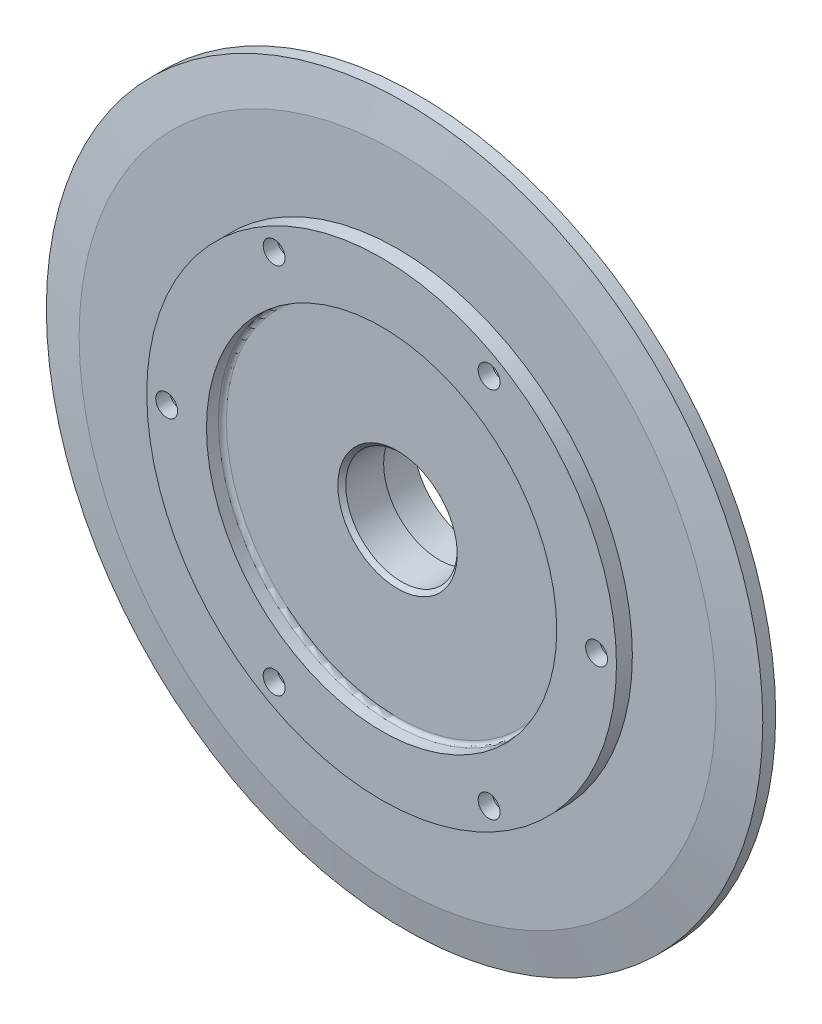
ISO-10303-21;
HEADER;
FILE_DESCRIPTION(('STEP AP214'),'2;1');
FILE_NAME('part.step','',(''),(''),'','','');
FILE_SCHEMA(('AUTOMOTIVE_DESIGN { 1 0 10303 214 1 1 1 1 }'));
ENDSEC;
DATA;
#1=APPLICATION_CONTEXT('core data for automotive mechanical design processes');
#2=APPLICATION_PROTOCOL_DEFINITION('international standard','automotive_design',2000,#1);
#3=PRODUCT_CONTEXT('',#1,'mechanical');
#4=PRODUCT('Part','Part','',(#3));
#5=PRODUCT_RELATED_PRODUCT_CATEGORY('part','',(#4));
#6=PRODUCT_DEFINITION_FORMATION('','',#4);
#7=PRODUCT_DEFINITION_CONTEXT('part definition',#1,'design');
#8=PRODUCT_DEFINITION('design','',#6,#7);
#9=PRODUCT_DEFINITION_SHAPE('','',#8);
#10=(LENGTH_UNIT() NAMED_UNIT(*) SI_UNIT(.MILLI.,.METRE.));
#11=(NAMED_UNIT(*) PLANE_ANGLE_UNIT() SI_UNIT($,.RADIAN.));
#12=(NAMED_UNIT(*) SI_UNIT($,.STERADIAN.) SOLID_ANGLE_UNIT());
#13=UNCERTAINTY_MEASURE_WITH_UNIT(LENGTH_MEASURE(1.E-05),#10,'distance_accuracy_value','');
#14=(GEOMETRIC_REPRESENTATION_CONTEXT(3) GLOBAL_UNCERTAINTY_ASSIGNED_CONTEXT((#13)) GLOBAL_UNIT_ASSIGNED_CONTEXT((#10,
#11,#12)) REPRESENTATION_CONTEXT('',''));
#15=CARTESIAN_POINT('',(0.,0.,0.));
#16=DIRECTION('',(0.,0.,1.));
#17=DIRECTION('',(1.,0.,0.));
#18=AXIS2_PLACEMENT_3D('',#15,#16,#17);
#19=CARTESIAN_POINT('',(0.,180.,-18.));
#20=DIRECTION('',(0.,0.,-1.));
#21=DIRECTION('',(-1.,0.,0.));
#22=AXIS2_PLACEMENT_3D('',#19,#20,#21);
#23=PLANE('',#22);
#24=CARTESIAN_POINT('',(0.,0.,-18.));
#25=DIRECTION('',(0.,0.,-1.));
#26=DIRECTION('',(-1.,0.,0.));
#27=AXIS2_PLACEMENT_3D('',#24,#25,#26);
#28=CIRCLE('',#27,45.);
#29=CARTESIAN_POINT('',(-45.,0.,-18.));
#30=VERTEX_POINT('',#29);
#31=EDGE_CURVE('E75',#30,#30,#28,.T.);
#32=ORIENTED_EDGE('',*,*,#31,.F.);
#33=EDGE_LOOP('',(#32));
#34=FACE_BOUND('',#33,.T.);
#35=CARTESIAN_POINT('',(0.,0.,-18.));
#36=DIRECTION('',(0.,0.,-1.));
#37=DIRECTION('',(-1.,0.,0.));
#38=AXIS2_PLACEMENT_3D('',#35,#36,#37);
#39=CIRCLE('',#38,70.);
#40=CARTESIAN_POINT('',(-70.,0.,-18.));
#41=VERTEX_POINT('',#40);
#42=EDGE_CURVE('E106',#41,#41,#39,.T.);
#43=ORIENTED_EDGE('',*,*,#42,.T.);
#44=EDGE_LOOP('',(#43));
#45=FACE_BOUND('',#44,.T.);
#46=ADVANCED_FACE('F39',(#34,#45),#23,.T.);
#47=CARTESIAN_POINT('',(0.,0.,0.));
#48=DIRECTION('',(0.,0.,1.));
#49=DIRECTION('',(1.,0.,0.));
#50=AXIS2_PLACEMENT_3D('',#47,#48,#49);
#51=PLANE('',#50);
#52=CARTESIAN_POINT('',(-108.,0.,0.));
#53=DIRECTION('',(0.,0.,1.));
#54=DIRECTION('',(1.,0.,0.));
#55=AXIS2_PLACEMENT_3D('',#52,#53,#54);
#56=CIRCLE('',#55,5.50000000000001);
#57=CARTESIAN_POINT('',(-102.5,0.,0.));
#58=VERTEX_POINT('',#57);
#59=EDGE_CURVE('E171',#58,#58,#56,.T.);
#60=ORIENTED_EDGE('',*,*,#59,.F.);
#61=EDGE_LOOP('',(#60));
#62=FACE_BOUND('',#61,.T.);
#63=CARTESIAN_POINT('',(-53.9999999999998,-93.5307436087195,0.));
#64=DIRECTION('',(0.,0.,1.));
#65=DIRECTION('',(1.,0.,0.));
#66=AXIS2_PLACEMENT_3D('',#63,#64,#65);
#67=CIRCLE('',#66,5.50000000000001);
#68=CARTESIAN_POINT('',(-48.4999999999998,-93.5307436087195,0.));
#69=VERTEX_POINT('',#68);
#70=EDGE_CURVE('E159',#69,#69,#67,.T.);
#71=ORIENTED_EDGE('',*,*,#70,.F.);
#72=EDGE_LOOP('',(#71));
#73=FACE_BOUND('',#72,.T.);
#74=CARTESIAN_POINT('',(54.0000000000004,-93.5307436087191,0.));
#75=DIRECTION('',(0.,0.,1.));
#76=DIRECTION('',(1.,0.,0.));
#77=AXIS2_PLACEMENT_3D('',#74,#75,#76);
#78=CIRCLE('',#77,5.50000000000001);
#79=CARTESIAN_POINT('',(59.5000000000004,-93.5307436087191,0.));
#80=VERTEX_POINT('',#79);
#81=EDGE_CURVE('E147',#80,#80,#78,.T.);
#82=ORIENTED_EDGE('',*,*,#81,.F.);
#83=EDGE_LOOP('',(#82));
#84=FACE_BOUND('',#83,.T.);
#85=CARTESIAN_POINT('',(108.,7.54159969190117E-13,0.));
#86=DIRECTION('',(0.,0.,1.));
#87=DIRECTION('',(1.,0.,0.));
#88=AXIS2_PLACEMENT_3D('',#85,#86,#87);
#89=CIRCLE('',#88,5.50000000000001);
#90=CARTESIAN_POINT('',(113.5,7.54159969190117E-13,0.));
#91=VERTEX_POINT('',#90);
#92=EDGE_CURVE('E135',#91,#91,#89,.T.);
#93=ORIENTED_EDGE('',*,*,#92,.F.);
#94=EDGE_LOOP('',(#93));
#95=FACE_BOUND('',#94,.T.);
#96=CARTESIAN_POINT('',(53.9999999999991,93.5307436087198,0.));
#97=DIRECTION('',(0.,0.,1.));
#98=DIRECTION('',(1.,0.,0.));
#99=AXIS2_PLACEMENT_3D('',#96,#97,#98);
#100=CIRCLE('',#99,5.50000000000001);
#101=CARTESIAN_POINT('',(59.4999999999991,93.5307436087198,0.));
#102=VERTEX_POINT('',#101);
#103=EDGE_CURVE('E123',#102,#102,#100,.T.);
#104=ORIENTED_EDGE('',*,*,#103,.F.);
#105=EDGE_LOOP('',(#104));
#106=FACE_BOUND('',#105,.T.);
#107=CARTESIAN_POINT('',(-54.0000000000011,93.5307436087187,0.));
#108=DIRECTION('',(0.,0.,1.));
#109=DIRECTION('',(1.,0.,0.));
#110=AXIS2_PLACEMENT_3D('',#107,#108,#109);
#111=CIRCLE('',#110,5.50000000000001);
#112=CARTESIAN_POINT('',(-48.5000000000011,93.5307436087187,0.));
#113=VERTEX_POINT('',#112);
#114=EDGE_CURVE('E109',#113,#113,#111,.T.);
#115=ORIENTED_EDGE('',*,*,#114,.F.);
#116=EDGE_LOOP('',(#115));
#117=FACE_BOUND('',#116,.T.);
#118=CARTESIAN_POINT('',(0.,0.,0.));
#119=DIRECTION('',(0.,0.,-1.));
#120=DIRECTION('',(-1.,0.,0.));
#121=AXIS2_PLACEMENT_3D('',#118,#119,#120);
#122=CIRCLE('',#121,88.);
#123=CARTESIAN_POINT('',(-88.,0.,0.));
#124=VERTEX_POINT('',#123);
#125=EDGE_CURVE('E87',#124,#124,#122,.T.);
#126=ORIENTED_EDGE('',*,*,#125,.T.);
#127=EDGE_LOOP('',(#126));
#128=FACE_BOUND('',#127,.T.);
#129=CARTESIAN_POINT('',(0.,0.,0.));
#130=DIRECTION('',(0.,0.,-1.));
#131=DIRECTION('',(-1.,0.,0.));
#132=AXIS2_PLACEMENT_3D('',#129,#130,#131);
#133=CIRCLE('',#132,118.);
#134=CARTESIAN_POINT('',(-118.,0.,0.));
#135=VERTEX_POINT('',#134);
#136=EDGE_CURVE('E60',#135,#135,#133,.T.);
#137=ORIENTED_EDGE('',*,*,#136,.F.);
#138=EDGE_LOOP('',(#137));
#139=FACE_BOUND('',#138,.T.);
#140=ADVANCED_FACE('F218',(#62,#73,#84,#95,#106,#117,#128,#139),#51,.T.);
#141=CARTESIAN_POINT('',(0.,0.,-47.));
#142=DIRECTION('',(0.,0.,-1.));
#143=DIRECTION('',(-1.,0.,0.));
#144=AXIS2_PLACEMENT_3D('',#141,#142,#143);
#145=CYLINDRICAL_SURFACE('',#144,118.);
#146=ORIENTED_EDGE('',*,*,#136,.T.);
#147=EDGE_LOOP('',(#146));
#148=FACE_BOUND('',#147,.T.);
#149=CARTESIAN_POINT('',(0.,0.,-8.00000000000001));
#150=DIRECTION('',(0.,0.,-1.));
#151=DIRECTION('',(-1.,0.,0.));
#152=AXIS2_PLACEMENT_3D('',#149,#150,#151);
#153=CIRCLE('',#152,118.);
#154=CARTESIAN_POINT('',(-118.,0.,-8.00000000000001));
#155=VERTEX_POINT('',#154);
#156=EDGE_CURVE('E63',#155,#155,#153,.T.);
#157=ORIENTED_EDGE('',*,*,#156,.F.);
#158=EDGE_LOOP('',(#157));
#159=FACE_BOUND('',#158,.T.);
#160=ADVANCED_FACE('F225',(#148,#159),#145,.T.);
#161=CARTESIAN_POINT('',(0.,118.,-8.00000000000001));
#162=DIRECTION('',(0.,0.,1.));
#163=DIRECTION('',(1.,0.,0.));
#164=AXIS2_PLACEMENT_3D('',#161,#162,#163);
#165=PLANE('',#164);
#166=ORIENTED_EDGE('',*,*,#156,.T.);
#167=EDGE_LOOP('',(#166));
#168=FACE_BOUND('',#167,.T.);
#169=CARTESIAN_POINT('',(0.,0.,-8.00000000000001));
#170=DIRECTION('',(0.,0.,-1.));
#171=DIRECTION('',(-1.,0.,0.));
#172=AXIS2_PLACEMENT_3D('',#169,#170,#171);
#173=CIRCLE('',#172,160.);
#174=CARTESIAN_POINT('',(-160.,0.,-8.00000000000001));
#175=VERTEX_POINT('',#174);
#176=EDGE_CURVE('E66',#175,#175,#173,.T.);
#177=ORIENTED_EDGE('',*,*,#176,.F.);
#178=EDGE_LOOP('',(#177));
#179=FACE_BOUND('',#178,.T.);
#180=ADVANCED_FACE('F214',(#168,#179),#165,.T.);
#181=CARTESIAN_POINT('',(0.,0.,-11.5265396141693));
#182=DIRECTION('',(0.,0.,-1.));
#183=DIRECTION('',(-1.,0.,0.));
#184=AXIS2_PLACEMENT_3D('',#181,#182,#183);
#185=CONICAL_SURFACE('',#184,180.,1.39626340159546);
#186=ORIENTED_EDGE('',*,*,#176,.T.);
#187=EDGE_LOOP('',(#186));
#188=FACE_BOUND('',#187,.T.);
#189=CARTESIAN_POINT('',(0.,0.,-11.5265396141693));
#190=DIRECTION('',(0.,0.,-1.));
#191=DIRECTION('',(-1.,0.,0.));
#192=AXIS2_PLACEMENT_3D('',#189,#190,#191);
#193=CIRCLE('',#192,180.);
#194=CARTESIAN_POINT('',(-180.,0.,-11.5265396141693));
#195=VERTEX_POINT('',#194);
#196=EDGE_CURVE('E69',#195,#195,#193,.T.);
#197=ORIENTED_EDGE('',*,*,#196,.F.);
#198=EDGE_LOOP('',(#197));
#199=FACE_BOUND('',#198,.T.);
#200=ADVANCED_FACE('F207',(#188,#199),#185,.T.);
#201=CARTESIAN_POINT('',(0.,0.,-47.));
#202=DIRECTION('',(0.,0.,-1.));
#203=DIRECTION('',(-1.,0.,0.));
#204=AXIS2_PLACEMENT_3D('',#201,#202,#203);
#205=CYLINDRICAL_SURFACE('',#204,180.);
#206=ORIENTED_EDGE('',*,*,#196,.T.);
#207=EDGE_LOOP('',(#206));
#208=FACE_BOUND('',#207,.T.);
#209=CARTESIAN_POINT('',(0.,0.,-18.));
#210=DIRECTION('',(0.,0.,-1.));
#211=DIRECTION('',(-1.,0.,0.));
#212=AXIS2_PLACEMENT_3D('',#209,#210,#211);
#213=CIRCLE('',#212,180.);
#214=CARTESIAN_POINT('',(-180.,0.,-18.));
#215=VERTEX_POINT('',#214);
#216=EDGE_CURVE('E72',#215,#215,#213,.T.);
#217=ORIENTED_EDGE('',*,*,#216,.F.);
#218=EDGE_LOOP('',(#217));
#219=FACE_BOUND('',#218,.T.);
#220=ADVANCED_FACE('F190',(#208,#219),#205,.T.);
#221=CARTESIAN_POINT('',(-108.,0.,-18.));
#222=DIRECTION('',(0.,0.,-1.));
#223=DIRECTION('',(-1.,0.,0.));
#224=AXIS2_PLACEMENT_3D('',#221,#222,#223);
#225=CIRCLE('',#224,8.50000000000001);
#226=CARTESIAN_POINT('',(-116.5,0.,-18.));
#227=VERTEX_POINT('',#226);
#228=EDGE_CURVE('E180',#227,#227,#225,.T.);
#229=ORIENTED_EDGE('',*,*,#228,.F.);
#230=EDGE_LOOP('',(#229));
#231=FACE_BOUND('',#230,.T.);
#232=CARTESIAN_POINT('',(-53.9999999999998,-93.5307436087195,-18.));
#233=DIRECTION('',(0.,0.,-1.));
#234=DIRECTION('',(-1.,0.,0.));
#235=AXIS2_PLACEMENT_3D('',#232,#233,#234);
#236=CIRCLE('',#235,8.50000000000001);
#237=CARTESIAN_POINT('',(-62.4999999999998,-93.5307436087195,-18.));
#238=VERTEX_POINT('',#237);
#239=EDGE_CURVE('E168',#238,#238,#236,.T.);
#240=ORIENTED_EDGE('',*,*,#239,.F.);
#241=EDGE_LOOP('',(#240));
#242=FACE_BOUND('',#241,.T.);
#243=CARTESIAN_POINT('',(54.0000000000004,-93.5307436087191,-18.));
#244=DIRECTION('',(0.,0.,-1.));
#245=DIRECTION('',(-1.,0.,0.));
#246=AXIS2_PLACEMENT_3D('',#243,#244,#245);
#247=CIRCLE('',#246,8.50000000000001);
#248=CARTESIAN_POINT('',(45.5000000000004,-93.5307436087191,-18.));
#249=VERTEX_POINT('',#248);
#250=EDGE_CURVE('E156',#249,#249,#247,.T.);
#251=ORIENTED_EDGE('',*,*,#250,.F.);
#252=EDGE_LOOP('',(#251));
#253=FACE_BOUND('',#252,.T.);
#254=CARTESIAN_POINT('',(108.,7.54159969190117E-13,-18.));
#255=DIRECTION('',(0.,0.,-1.));
#256=DIRECTION('',(-1.,0.,0.));
#257=AXIS2_PLACEMENT_3D('',#254,#255,#256);
#258=CIRCLE('',#257,8.50000000000001);
#259=CARTESIAN_POINT('',(99.5,7.54159969190117E-13,-18.));
#260=VERTEX_POINT('',#259);
#261=EDGE_CURVE('E144',#260,#260,#258,.T.);
#262=ORIENTED_EDGE('',*,*,#261,.F.);
#263=EDGE_LOOP('',(#262));
#264=FACE_BOUND('',#263,.T.);
#265=CARTESIAN_POINT('',(53.9999999999991,93.5307436087198,-18.));
#266=DIRECTION('',(0.,0.,-1.));
#267=DIRECTION('',(-1.,0.,0.));
#268=AXIS2_PLACEMENT_3D('',#265,#266,#267);
#269=CIRCLE('',#268,8.50000000000001);
#270=CARTESIAN_POINT('',(45.4999999999991,93.5307436087198,-18.));
#271=VERTEX_POINT('',#270);
#272=EDGE_CURVE('E132',#271,#271,#269,.T.);
#273=ORIENTED_EDGE('',*,*,#272,.F.);
#274=EDGE_LOOP('',(#273));
#275=FACE_BOUND('',#274,.T.);
#276=CARTESIAN_POINT('',(-54.0000000000011,93.5307436087187,-18.));
#277=DIRECTION('',(0.,0.,-1.));
#278=DIRECTION('',(-1.,0.,0.));
#279=AXIS2_PLACEMENT_3D('',#276,#277,#278);
#280=CIRCLE('',#279,8.50000000000001);
#281=CARTESIAN_POINT('',(-62.5000000000011,93.5307436087187,-18.));
#282=VERTEX_POINT('',#281);
#283=EDGE_CURVE('E120',#282,#282,#280,.T.);
#284=ORIENTED_EDGE('',*,*,#283,.F.);
#285=EDGE_LOOP('',(#284));
#286=FACE_BOUND('',#285,.T.);
#287=CARTESIAN_POINT('',(0.,0.,-18.));
#288=DIRECTION('',(0.,0.,-1.));
#289=DIRECTION('',(-1.,0.,0.));
#290=AXIS2_PLACEMENT_3D('',#287,#288,#289);
#291=CIRCLE('',#290,77.);
#292=CARTESIAN_POINT('',(-77.,0.,-18.));
#293=VERTEX_POINT('',#292);
#294=EDGE_CURVE('E100',#293,#293,#291,.T.);
#295=ORIENTED_EDGE('',*,*,#294,.F.);
#296=EDGE_LOOP('',(#295));
#297=FACE_BOUND('',#296,.T.);
#298=ORIENTED_EDGE('',*,*,#216,.T.);
#299=EDGE_LOOP('',(#298));
#300=FACE_BOUND('',#299,.T.);
#301=ADVANCED_FACE('F186',(#231,#242,#253,#264,#275,#286,#297,#300),#23,.T.);
#302=CARTESIAN_POINT('',(0.,0.,-47.));
#303=DIRECTION('',(0.,0.,-1.));
#304=DIRECTION('',(-1.,0.,0.));
#305=AXIS2_PLACEMENT_3D('',#302,#303,#304);
#306=CYLINDRICAL_SURFACE('',#305,45.);
#307=ORIENTED_EDGE('',*,*,#31,.T.);
#308=EDGE_LOOP('',(#307));
#309=FACE_BOUND('',#308,.T.);
#310=CARTESIAN_POINT('',(0.,0.,-21.));
#311=DIRECTION('',(0.,0.,-1.));
#312=DIRECTION('',(-1.,0.,0.));
#313=AXIS2_PLACEMENT_3D('',#310,#311,#312);
#314=CIRCLE('',#313,45.);
#315=CARTESIAN_POINT('',(-45.,0.,-21.));
#316=VERTEX_POINT('',#315);
#317=EDGE_CURVE('E78',#316,#316,#314,.T.);
#318=ORIENTED_EDGE('',*,*,#317,.F.);
#319=EDGE_LOOP('',(#318));
#320=FACE_BOUND('',#319,.T.);
#321=ADVANCED_FACE('F189',(#309,#320),#306,.T.);
#322=CARTESIAN_POINT('',(0.,45.,-21.));
#323=DIRECTION('',(0.,0.,-1.));
#324=DIRECTION('',(-1.,0.,0.));
#325=AXIS2_PLACEMENT_3D('',#322,#323,#324);
#326=PLANE('',#325);
#327=ORIENTED_EDGE('',*,*,#317,.T.);
#328=EDGE_LOOP('',(#327));
#329=FACE_BOUND('',#328,.T.);
#330=CARTESIAN_POINT('',(0.,0.,-21.));
#331=DIRECTION('',(0.,0.,-1.));
#332=DIRECTION('',(-1.,0.,0.));
#333=AXIS2_PLACEMENT_3D('',#330,#331,#332);
#334=CIRCLE('',#333,40.);
#335=CARTESIAN_POINT('',(-40.,0.,-21.));
#336=VERTEX_POINT('',#335);
#337=EDGE_CURVE('E81',#336,#336,#334,.T.);
#338=ORIENTED_EDGE('',*,*,#337,.F.);
#339=EDGE_LOOP('',(#338));
#340=FACE_BOUND('',#339,.T.);
#341=ADVANCED_FACE('F232',(#329,#340),#326,.T.);
#342=CARTESIAN_POINT('',(0.,0.,-47.));
#343=DIRECTION('',(0.,0.,-1.));
#344=DIRECTION('',(-1.,0.,0.));
#345=AXIS2_PLACEMENT_3D('',#342,#343,#344);
#346=CYLINDRICAL_SURFACE('',#345,40.);
#347=ORIENTED_EDGE('',*,*,#337,.T.);
#348=EDGE_LOOP('',(#347));
#349=FACE_BOUND('',#348,.T.);
#350=CARTESIAN_POINT('',(0.,0.,-47.));
#351=DIRECTION('',(0.,0.,-1.));
#352=DIRECTION('',(-1.,0.,0.));
#353=AXIS2_PLACEMENT_3D('',#350,#351,#352);
#354=CIRCLE('',#353,40.);
#355=CARTESIAN_POINT('',(-40.,0.,-47.));
#356=VERTEX_POINT('',#355);
#357=EDGE_CURVE('E84',#356,#356,#354,.T.);
#358=ORIENTED_EDGE('',*,*,#357,.F.);
#359=EDGE_LOOP('',(#358));
#360=FACE_BOUND('',#359,.T.);
#361=ADVANCED_FACE('F236',(#349,#360),#346,.T.);
#362=CARTESIAN_POINT('',(0.,40.,-47.));
#363=DIRECTION('',(0.,0.,-1.));
#364=DIRECTION('',(-1.,0.,0.));
#365=AXIS2_PLACEMENT_3D('',#362,#363,#364);
#366=PLANE('',#365);
#367=CARTESIAN_POINT('',(0.,0.,-47.));
#368=DIRECTION('',(0.,0.,-1.));
#369=DIRECTION('',(-1.,0.,0.));
#370=AXIS2_PLACEMENT_3D('',#367,#368,#369);
#371=CIRCLE('',#370,31.);
#372=CARTESIAN_POINT('',(-31.,0.,-47.));
#373=VERTEX_POINT('',#372);
#374=EDGE_CURVE('E96',#373,#373,#371,.T.);
#375=ORIENTED_EDGE('',*,*,#374,.F.);
#376=EDGE_LOOP('',(#375));
#377=FACE_BOUND('',#376,.T.);
#378=ORIENTED_EDGE('',*,*,#357,.T.);
#379=EDGE_LOOP('',(#378));
#380=FACE_BOUND('',#379,.T.);
#381=ADVANCED_FACE('F240',(#377,#380),#366,.T.);
#382=CARTESIAN_POINT('',(0.,0.,-47.));
#383=DIRECTION('',(0.,0.,-1.));
#384=DIRECTION('',(-1.,0.,0.));
#385=AXIS2_PLACEMENT_3D('',#382,#383,#384);
#386=CYLINDRICAL_SURFACE('',#385,88.);
#387=CARTESIAN_POINT('',(0.,0.,-6.));
#388=DIRECTION('',(0.,0.,-1.));
#389=DIRECTION('',(-1.,0.,0.));
#390=AXIS2_PLACEMENT_3D('',#387,#388,#389);
#391=CIRCLE('',#390,88.);
#392=CARTESIAN_POINT('',(-88.,0.,-6.));
#393=VERTEX_POINT('',#392);
#394=EDGE_CURVE('E55',#393,#393,#391,.T.);
#395=ORIENTED_EDGE('',*,*,#394,.T.);
#396=EDGE_LOOP('',(#395));
#397=FACE_BOUND('',#396,.T.);
#398=ORIENTED_EDGE('',*,*,#125,.F.);
#399=EDGE_LOOP('',(#398));
#400=FACE_BOUND('',#399,.T.);
#401=ADVANCED_FACE('F244',(#397,#400),#386,.F.);
#402=CARTESIAN_POINT('',(0.,88.,-8.));
#403=DIRECTION('',(0.,0.,-1.));
#404=DIRECTION('',(-1.,0.,0.));
#405=AXIS2_PLACEMENT_3D('',#402,#403,#404);
#406=PLANE('',#405);
#407=CARTESIAN_POINT('',(0.,0.,-8.));
#408=DIRECTION('',(0.,0.,-1.));
#409=DIRECTION('',(-1.,0.,0.));
#410=AXIS2_PLACEMENT_3D('',#407,#408,#409);
#411=CIRCLE('',#410,30.);
#412=CARTESIAN_POINT('',(-30.,0.,-8.));
#413=VERTEX_POINT('',#412);
#414=EDGE_CURVE('E47',#413,#413,#411,.T.);
#415=ORIENTED_EDGE('',*,*,#414,.T.);
#416=EDGE_LOOP('',(#415));
#417=FACE_BOUND('',#416,.T.);
#418=CARTESIAN_POINT('',(0.,0.,-8.));
#419=DIRECTION('',(0.,0.,-1.));
#420=DIRECTION('',(-1.,0.,0.));
#421=AXIS2_PLACEMENT_3D('',#418,#419,#420);
#422=CIRCLE('',#421,86.);
#423=CARTESIAN_POINT('',(-86.,0.,-8.));
#424=VERTEX_POINT('',#423);
#425=EDGE_CURVE('E51',#424,#424,#422,.F.);
#426=ORIENTED_EDGE('',*,*,#425,.T.);
#427=EDGE_LOOP('',(#426));
#428=FACE_BOUND('',#427,.T.);
#429=ADVANCED_FACE('F248',(#417,#428),#406,.F.);
#430=CARTESIAN_POINT('',(0.,0.,-47.));
#431=DIRECTION('',(0.,0.,-1.));
#432=DIRECTION('',(-1.,0.,0.));
#433=AXIS2_PLACEMENT_3D('',#430,#431,#432);
#434=CYLINDRICAL_SURFACE('',#433,28.);
#435=CARTESIAN_POINT('',(0.,0.,-10.));
#436=DIRECTION('',(0.,0.,-1.));
#437=DIRECTION('',(-1.,0.,0.));
#438=AXIS2_PLACEMENT_3D('',#435,#436,#437);
#439=CIRCLE('',#438,28.);
#440=CARTESIAN_POINT('',(-28.,0.,-10.));
#441=VERTEX_POINT('',#440);
#442=EDGE_CURVE('E10',#441,#441,#439,.F.);
#443=ORIENTED_EDGE('',*,*,#442,.T.);
#444=EDGE_LOOP('',(#443));
#445=FACE_BOUND('',#444,.T.);
#446=CARTESIAN_POINT('',(0.,0.,-29.));
#447=DIRECTION('',(0.,0.,-1.));
#448=DIRECTION('',(-1.,0.,0.));
#449=AXIS2_PLACEMENT_3D('',#446,#447,#448);
#450=CIRCLE('',#449,28.);
#451=CARTESIAN_POINT('',(-28.,0.,-29.));
#452=VERTEX_POINT('',#451);
#453=EDGE_CURVE('E90',#452,#452,#450,.T.);
#454=ORIENTED_EDGE('',*,*,#453,.T.);
#455=EDGE_LOOP('',(#454));
#456=FACE_BOUND('',#455,.T.);
#457=ADVANCED_FACE('F252',(#445,#456),#434,.F.);
#458=CARTESIAN_POINT('',(0.,28.,-29.));
#459=DIRECTION('',(0.,0.,1.));
#460=DIRECTION('',(1.,0.,0.));
#461=AXIS2_PLACEMENT_3D('',#458,#459,#460);
#462=PLANE('',#461);
#463=ORIENTED_EDGE('',*,*,#453,.F.);
#464=EDGE_LOOP('',(#463));
#465=FACE_BOUND('',#464,.T.);
#466=CARTESIAN_POINT('',(0.,0.,-29.));
#467=DIRECTION('',(0.,0.,-1.));
#468=DIRECTION('',(-1.,0.,0.));
#469=AXIS2_PLACEMENT_3D('',#466,#467,#468);
#470=CIRCLE('',#469,31.);
#471=CARTESIAN_POINT('',(-31.,0.,-29.));
#472=VERTEX_POINT('',#471);
#473=EDGE_CURVE('E93',#472,#472,#470,.T.);
#474=ORIENTED_EDGE('',*,*,#473,.T.);
#475=EDGE_LOOP('',(#474));
#476=FACE_BOUND('',#475,.T.);
#477=ADVANCED_FACE('F255',(#465,#476),#462,.F.);
#478=CARTESIAN_POINT('',(0.,0.,-47.));
#479=DIRECTION('',(0.,0.,-1.));
#480=DIRECTION('',(-1.,0.,0.));
#481=AXIS2_PLACEMENT_3D('',#478,#479,#480);
#482=CYLINDRICAL_SURFACE('',#481,31.);
#483=ORIENTED_EDGE('',*,*,#473,.F.);
#484=EDGE_LOOP('',(#483));
#485=FACE_BOUND('',#484,.T.);
#486=ORIENTED_EDGE('',*,*,#374,.T.);
#487=EDGE_LOOP('',(#486));
#488=FACE_BOUND('',#487,.T.);
#489=ADVANCED_FACE('F258',(#485,#488),#482,.F.);
#490=CARTESIAN_POINT('',(0.,0.,-14.));
#491=DIRECTION('',(0.,0.,-1.));
#492=DIRECTION('',(-1.,0.,0.));
#493=AXIS2_PLACEMENT_3D('',#490,#491,#492);
#494=CYLINDRICAL_SURFACE('',#493,77.);
#495=CARTESIAN_POINT('',(0.,0.,-14.));
#496=DIRECTION('',(0.,0.,-1.));
#497=DIRECTION('',(-1.,0.,0.));
#498=AXIS2_PLACEMENT_3D('',#495,#496,#497);
#499=CIRCLE('',#498,77.);
#500=CARTESIAN_POINT('',(-77.,0.,-14.));
#501=VERTEX_POINT('',#500);
#502=EDGE_CURVE('E99',#501,#501,#499,.T.);
#503=ORIENTED_EDGE('',*,*,#502,.F.);
#504=EDGE_LOOP('',(#503));
#505=FACE_BOUND('',#504,.T.);
#506=ORIENTED_EDGE('',*,*,#294,.T.);
#507=EDGE_LOOP('',(#506));
#508=FACE_BOUND('',#507,.T.);
#509=ADVANCED_FACE('F261',(#505,#508),#494,.F.);
#510=CARTESIAN_POINT('',(0.,0.,-14.));
#511=DIRECTION('',(0.,0.,-1.));
#512=DIRECTION('',(-1.,0.,0.));
#513=AXIS2_PLACEMENT_3D('',#510,#511,#512);
#514=PLANE('',#513);
#515=CARTESIAN_POINT('',(0.,0.,-14.));
#516=DIRECTION('',(0.,0.,-1.));
#517=DIRECTION('',(-1.,0.,0.));
#518=AXIS2_PLACEMENT_3D('',#515,#516,#517);
#519=CIRCLE('',#518,70.);
#520=CARTESIAN_POINT('',(-70.,0.,-14.));
#521=VERTEX_POINT('',#520);
#522=EDGE_CURVE('E103',#521,#521,#519,.T.);
#523=ORIENTED_EDGE('',*,*,#522,.F.);
#524=EDGE_LOOP('',(#523));
#525=FACE_BOUND('',#524,.T.);
#526=ORIENTED_EDGE('',*,*,#502,.T.);
#527=EDGE_LOOP('',(#526));
#528=FACE_BOUND('',#527,.T.);
#529=ADVANCED_FACE('F264',(#525,#528),#514,.T.);
#530=CARTESIAN_POINT('',(0.,0.,-14.));
#531=DIRECTION('',(0.,0.,-1.));
#532=DIRECTION('',(-1.,0.,0.));
#533=AXIS2_PLACEMENT_3D('',#530,#531,#532);
#534=CYLINDRICAL_SURFACE('',#533,70.);
#535=ORIENTED_EDGE('',*,*,#522,.T.);
#536=EDGE_LOOP('',(#535));
#537=FACE_BOUND('',#536,.T.);
#538=ORIENTED_EDGE('',*,*,#42,.F.);
#539=EDGE_LOOP('',(#538));
#540=FACE_BOUND('',#539,.T.);
#541=ADVANCED_FACE('F268',(#537,#540),#534,.T.);
#542=CARTESIAN_POINT('',(-54.0000000000011,93.5307436087187,-18.));
#543=DIRECTION('',(0.,0.,-1.));
#544=DIRECTION('',(-1.,0.,0.));
#545=AXIS2_PLACEMENT_3D('',#542,#543,#544);
#546=CYLINDRICAL_SURFACE('',#545,5.50000000000001);
#547=CARTESIAN_POINT('',(-54.0000000000011,93.5307436087187,-7.00000000000001));
#548=DIRECTION('',(0.,0.,-1.));
#549=DIRECTION('',(-1.,0.,0.));
#550=AXIS2_PLACEMENT_3D('',#547,#548,#549);
#551=CIRCLE('',#550,5.50000000000001);
#552=CARTESIAN_POINT('',(-59.5000000000011,93.5307436087187,-7.00000000000001));
#553=VERTEX_POINT('',#552);
#554=EDGE_CURVE('E114',#553,#553,#551,.T.);
#555=ORIENTED_EDGE('',*,*,#554,.T.);
#556=EDGE_LOOP('',(#555));
#557=FACE_BOUND('',#556,.T.);
#558=ORIENTED_EDGE('',*,*,#114,.T.);
#559=EDGE_LOOP('',(#558));
#560=FACE_BOUND('',#559,.T.);
#561=ADVANCED_FACE('F272',(#557,#560),#546,.F.);
#562=CARTESIAN_POINT('',(-48.5000000000011,93.5307436087187,-7.00000000000001));
#563=DIRECTION('',(0.,0.,1.));
#564=DIRECTION('',(1.,0.,0.));
#565=AXIS2_PLACEMENT_3D('',#562,#563,#564);
#566=PLANE('',#565);
#567=ORIENTED_EDGE('',*,*,#554,.F.);
#568=EDGE_LOOP('',(#567));
#569=FACE_BOUND('',#568,.T.);
#570=CARTESIAN_POINT('',(-54.0000000000011,93.5307436087187,-7.00000000000001));
#571=DIRECTION('',(0.,0.,-1.));
#572=DIRECTION('',(-1.,0.,0.));
#573=AXIS2_PLACEMENT_3D('',#570,#571,#572);
#574=CIRCLE('',#573,8.50000000000001);
#575=CARTESIAN_POINT('',(-62.5000000000011,93.5307436087187,-7.00000000000001));
#576=VERTEX_POINT('',#575);
#577=EDGE_CURVE('E117',#576,#576,#574,.T.);
#578=ORIENTED_EDGE('',*,*,#577,.T.);
#579=EDGE_LOOP('',(#578));
#580=FACE_BOUND('',#579,.T.);
#581=ADVANCED_FACE('F276',(#569,#580),#566,.F.);
#582=CARTESIAN_POINT('',(-54.0000000000011,93.5307436087187,-18.));
#583=DIRECTION('',(0.,0.,-1.));
#584=DIRECTION('',(-1.,0.,0.));
#585=AXIS2_PLACEMENT_3D('',#582,#583,#584);
#586=CYLINDRICAL_SURFACE('',#585,8.50000000000001);
#587=ORIENTED_EDGE('',*,*,#577,.F.);
#588=EDGE_LOOP('',(#587));
#589=FACE_BOUND('',#588,.T.);
#590=ORIENTED_EDGE('',*,*,#283,.T.);
#591=EDGE_LOOP('',(#590));
#592=FACE_BOUND('',#591,.T.);
#593=ADVANCED_FACE('F280',(#589,#592),#586,.F.);
#594=CARTESIAN_POINT('',(53.9999999999991,93.5307436087198,-18.));
#595=DIRECTION('',(0.,0.,-1.));
#596=DIRECTION('',(-1.,0.,0.));
#597=AXIS2_PLACEMENT_3D('',#594,#595,#596);
#598=CYLINDRICAL_SURFACE('',#597,5.50000000000001);
#599=CARTESIAN_POINT('',(53.9999999999991,93.5307436087198,-7.00000000000001));
#600=DIRECTION('',(0.,0.,-1.));
#601=DIRECTION('',(-1.,0.,0.));
#602=AXIS2_PLACEMENT_3D('',#599,#600,#601);
#603=CIRCLE('',#602,5.50000000000001);
#604=CARTESIAN_POINT('',(48.4999999999991,93.5307436087198,-7.00000000000001));
#605=VERTEX_POINT('',#604);
#606=EDGE_CURVE('E126',#605,#605,#603,.T.);
#607=ORIENTED_EDGE('',*,*,#606,.T.);
#608=EDGE_LOOP('',(#607));
#609=FACE_BOUND('',#608,.T.);
#610=ORIENTED_EDGE('',*,*,#103,.T.);
#611=EDGE_LOOP('',(#610));
#612=FACE_BOUND('',#611,.T.);
#613=ADVANCED_FACE('F284',(#609,#612),#598,.F.);
#614=CARTESIAN_POINT('',(59.4999999999991,93.5307436087198,-7.00000000000001));
#615=DIRECTION('',(0.,0.,1.));
#616=DIRECTION('',(1.,0.,0.));
#617=AXIS2_PLACEMENT_3D('',#614,#615,#616);
#618=PLANE('',#617);
#619=ORIENTED_EDGE('',*,*,#606,.F.);
#620=EDGE_LOOP('',(#619));
#621=FACE_BOUND('',#620,.T.);
#622=CARTESIAN_POINT('',(53.9999999999991,93.5307436087198,-7.00000000000001));
#623=DIRECTION('',(0.,0.,-1.));
#624=DIRECTION('',(-1.,0.,0.));
#625=AXIS2_PLACEMENT_3D('',#622,#623,#624);
#626=CIRCLE('',#625,8.50000000000001);
#627=CARTESIAN_POINT('',(45.4999999999991,93.5307436087198,-7.00000000000001));
#628=VERTEX_POINT('',#627);
#629=EDGE_CURVE('E129',#628,#628,#626,.T.);
#630=ORIENTED_EDGE('',*,*,#629,.T.);
#631=EDGE_LOOP('',(#630));
#632=FACE_BOUND('',#631,.T.);
#633=ADVANCED_FACE('F288',(#621,#632),#618,.F.);
#634=CARTESIAN_POINT('',(53.9999999999991,93.5307436087198,-18.));
#635=DIRECTION('',(0.,0.,-1.));
#636=DIRECTION('',(-1.,0.,0.));
#637=AXIS2_PLACEMENT_3D('',#634,#635,#636);
#638=CYLINDRICAL_SURFACE('',#637,8.50000000000001);
#639=ORIENTED_EDGE('',*,*,#629,.F.);
#640=EDGE_LOOP('',(#639));
#641=FACE_BOUND('',#640,.T.);
#642=ORIENTED_EDGE('',*,*,#272,.T.);
#643=EDGE_LOOP('',(#642));
#644=FACE_BOUND('',#643,.T.);
#645=ADVANCED_FACE('F292',(#641,#644),#638,.F.);
#646=CARTESIAN_POINT('',(108.,7.54159969190117E-13,-18.));
#647=DIRECTION('',(0.,0.,-1.));
#648=DIRECTION('',(-1.,0.,0.));
#649=AXIS2_PLACEMENT_3D('',#646,#647,#648);
#650=CYLINDRICAL_SURFACE('',#649,5.50000000000001);
#651=CARTESIAN_POINT('',(108.,7.54159969190117E-13,-7.00000000000001));
#652=DIRECTION('',(0.,0.,-1.));
#653=DIRECTION('',(-1.,0.,0.));
#654=AXIS2_PLACEMENT_3D('',#651,#652,#653);
#655=CIRCLE('',#654,5.50000000000001);
#656=CARTESIAN_POINT('',(102.5,7.54159969190117E-13,-7.00000000000001));
#657=VERTEX_POINT('',#656);
#658=EDGE_CURVE('E138',#657,#657,#655,.T.);
#659=ORIENTED_EDGE('',*,*,#658,.T.);
#660=EDGE_LOOP('',(#659));
#661=FACE_BOUND('',#660,.T.);
#662=ORIENTED_EDGE('',*,*,#92,.T.);
#663=EDGE_LOOP('',(#662));
#664=FACE_BOUND('',#663,.T.);
#665=ADVANCED_FACE('F296',(#661,#664),#650,.F.);
#666=CARTESIAN_POINT('',(113.5,7.54159969190117E-13,-7.00000000000001));
#667=DIRECTION('',(0.,0.,1.));
#668=DIRECTION('',(1.,0.,0.));
#669=AXIS2_PLACEMENT_3D('',#666,#667,#668);
#670=PLANE('',#669);
#671=ORIENTED_EDGE('',*,*,#658,.F.);
#672=EDGE_LOOP('',(#671));
#673=FACE_BOUND('',#672,.T.);
#674=CARTESIAN_POINT('',(108.,7.54159969190117E-13,-7.00000000000001));
#675=DIRECTION('',(0.,0.,-1.));
#676=DIRECTION('',(-1.,0.,0.));
#677=AXIS2_PLACEMENT_3D('',#674,#675,#676);
#678=CIRCLE('',#677,8.50000000000001);
#679=CARTESIAN_POINT('',(99.5,7.54159969190117E-13,-7.00000000000001));
#680=VERTEX_POINT('',#679);
#681=EDGE_CURVE('E141',#680,#680,#678,.T.);
#682=ORIENTED_EDGE('',*,*,#681,.T.);
#683=EDGE_LOOP('',(#682));
#684=FACE_BOUND('',#683,.T.);
#685=ADVANCED_FACE('F300',(#673,#684),#670,.F.);
#686=CARTESIAN_POINT('',(108.,7.54159969190117E-13,-18.));
#687=DIRECTION('',(0.,0.,-1.));
#688=DIRECTION('',(-1.,0.,0.));
#689=AXIS2_PLACEMENT_3D('',#686,#687,#688);
#690=CYLINDRICAL_SURFACE('',#689,8.50000000000001);
#691=ORIENTED_EDGE('',*,*,#681,.F.);
#692=EDGE_LOOP('',(#691));
#693=FACE_BOUND('',#692,.T.);
#694=ORIENTED_EDGE('',*,*,#261,.T.);
#695=EDGE_LOOP('',(#694));
#696=FACE_BOUND('',#695,.T.);
#697=ADVANCED_FACE('F304',(#693,#696),#690,.F.);
#698=CARTESIAN_POINT('',(54.0000000000004,-93.5307436087191,-18.));
#699=DIRECTION('',(0.,0.,-1.));
#700=DIRECTION('',(-1.,0.,0.));
#701=AXIS2_PLACEMENT_3D('',#698,#699,#700);
#702=CYLINDRICAL_SURFACE('',#701,5.50000000000001);
#703=CARTESIAN_POINT('',(54.0000000000004,-93.5307436087191,-7.00000000000001));
#704=DIRECTION('',(0.,0.,-1.));
#705=DIRECTION('',(-1.,0.,0.));
#706=AXIS2_PLACEMENT_3D('',#703,#704,#705);
#707=CIRCLE('',#706,5.50000000000001);
#708=CARTESIAN_POINT('',(48.5000000000004,-93.5307436087191,-7.00000000000001));
#709=VERTEX_POINT('',#708);
#710=EDGE_CURVE('E150',#709,#709,#707,.T.);
#711=ORIENTED_EDGE('',*,*,#710,.T.);
#712=EDGE_LOOP('',(#711));
#713=FACE_BOUND('',#712,.T.);
#714=ORIENTED_EDGE('',*,*,#81,.T.);
#715=EDGE_LOOP('',(#714));
#716=FACE_BOUND('',#715,.T.);
#717=ADVANCED_FACE('F308',(#713,#716),#702,.F.);
#718=CARTESIAN_POINT('',(59.5000000000004,-93.5307436087191,-7.00000000000001));
#719=DIRECTION('',(0.,0.,1.));
#720=DIRECTION('',(1.,0.,0.));
#721=AXIS2_PLACEMENT_3D('',#718,#719,#720);
#722=PLANE('',#721);
#723=ORIENTED_EDGE('',*,*,#710,.F.);
#724=EDGE_LOOP('',(#723));
#725=FACE_BOUND('',#724,.T.);
#726=CARTESIAN_POINT('',(54.0000000000004,-93.5307436087191,-7.00000000000001));
#727=DIRECTION('',(0.,0.,-1.));
#728=DIRECTION('',(-1.,0.,0.));
#729=AXIS2_PLACEMENT_3D('',#726,#727,#728);
#730=CIRCLE('',#729,8.50000000000001);
#731=CARTESIAN_POINT('',(45.5000000000004,-93.5307436087191,-7.00000000000001));
#732=VERTEX_POINT('',#731);
#733=EDGE_CURVE('E153',#732,#732,#730,.T.);
#734=ORIENTED_EDGE('',*,*,#733,.T.);
#735=EDGE_LOOP('',(#734));
#736=FACE_BOUND('',#735,.T.);
#737=ADVANCED_FACE('F312',(#725,#736),#722,.F.);
#738=CARTESIAN_POINT('',(54.0000000000004,-93.5307436087191,-18.));
#739=DIRECTION('',(0.,0.,-1.));
#740=DIRECTION('',(-1.,0.,0.));
#741=AXIS2_PLACEMENT_3D('',#738,#739,#740);
#742=CYLINDRICAL_SURFACE('',#741,8.50000000000001);
#743=ORIENTED_EDGE('',*,*,#733,.F.);
#744=EDGE_LOOP('',(#743));
#745=FACE_BOUND('',#744,.T.);
#746=ORIENTED_EDGE('',*,*,#250,.T.);
#747=EDGE_LOOP('',(#746));
#748=FACE_BOUND('',#747,.T.);
#749=ADVANCED_FACE('F316',(#745,#748),#742,.F.);
#750=CARTESIAN_POINT('',(-53.9999999999998,-93.5307436087195,-18.));
#751=DIRECTION('',(0.,0.,-1.));
#752=DIRECTION('',(-1.,0.,0.));
#753=AXIS2_PLACEMENT_3D('',#750,#751,#752);
#754=CYLINDRICAL_SURFACE('',#753,5.50000000000001);
#755=CARTESIAN_POINT('',(-53.9999999999998,-93.5307436087195,-7.00000000000001));
#756=DIRECTION('',(0.,0.,-1.));
#757=DIRECTION('',(-1.,0.,0.));
#758=AXIS2_PLACEMENT_3D('',#755,#756,#757);
#759=CIRCLE('',#758,5.50000000000001);
#760=CARTESIAN_POINT('',(-59.4999999999998,-93.5307436087195,-7.00000000000001));
#761=VERTEX_POINT('',#760);
#762=EDGE_CURVE('E162',#761,#761,#759,.T.);
#763=ORIENTED_EDGE('',*,*,#762,.T.);
#764=EDGE_LOOP('',(#763));
#765=FACE_BOUND('',#764,.T.);
#766=ORIENTED_EDGE('',*,*,#70,.T.);
#767=EDGE_LOOP('',(#766));
#768=FACE_BOUND('',#767,.T.);
#769=ADVANCED_FACE('F320',(#765,#768),#754,.F.);
#770=CARTESIAN_POINT('',(-48.4999999999998,-93.5307436087195,-7.00000000000001));
#771=DIRECTION('',(0.,0.,1.));
#772=DIRECTION('',(1.,0.,0.));
#773=AXIS2_PLACEMENT_3D('',#770,#771,#772);
#774=PLANE('',#773);
#775=ORIENTED_EDGE('',*,*,#762,.F.);
#776=EDGE_LOOP('',(#775));
#777=FACE_BOUND('',#776,.T.);
#778=CARTESIAN_POINT('',(-53.9999999999998,-93.5307436087195,-7.00000000000001));
#779=DIRECTION('',(0.,0.,-1.));
#780=DIRECTION('',(-1.,0.,0.));
#781=AXIS2_PLACEMENT_3D('',#778,#779,#780);
#782=CIRCLE('',#781,8.50000000000001);
#783=CARTESIAN_POINT('',(-62.4999999999998,-93.5307436087195,-7.00000000000001));
#784=VERTEX_POINT('',#783);
#785=EDGE_CURVE('E165',#784,#784,#782,.T.);
#786=ORIENTED_EDGE('',*,*,#785,.T.);
#787=EDGE_LOOP('',(#786));
#788=FACE_BOUND('',#787,.T.);
#789=ADVANCED_FACE('F324',(#777,#788),#774,.F.);
#790=CARTESIAN_POINT('',(-53.9999999999998,-93.5307436087195,-18.));
#791=DIRECTION('',(0.,0.,-1.));
#792=DIRECTION('',(-1.,0.,0.));
#793=AXIS2_PLACEMENT_3D('',#790,#791,#792);
#794=CYLINDRICAL_SURFACE('',#793,8.50000000000001);
#795=ORIENTED_EDGE('',*,*,#785,.F.);
#796=EDGE_LOOP('',(#795));
#797=FACE_BOUND('',#796,.T.);
#798=ORIENTED_EDGE('',*,*,#239,.T.);
#799=EDGE_LOOP('',(#798));
#800=FACE_BOUND('',#799,.T.);
#801=ADVANCED_FACE('F328',(#797,#800),#794,.F.);
#802=CARTESIAN_POINT('',(-108.,0.,-18.));
#803=DIRECTION('',(0.,0.,-1.));
#804=DIRECTION('',(-1.,0.,0.));
#805=AXIS2_PLACEMENT_3D('',#802,#803,#804);
#806=CYLINDRICAL_SURFACE('',#805,5.50000000000001);
#807=CARTESIAN_POINT('',(-108.,0.,-7.00000000000001));
#808=DIRECTION('',(0.,0.,-1.));
#809=DIRECTION('',(-1.,0.,0.));
#810=AXIS2_PLACEMENT_3D('',#807,#808,#809);
#811=CIRCLE('',#810,5.50000000000001);
#812=CARTESIAN_POINT('',(-113.5,0.,-7.00000000000001));
#813=VERTEX_POINT('',#812);
#814=EDGE_CURVE('E174',#813,#813,#811,.T.);
#815=ORIENTED_EDGE('',*,*,#814,.T.);
#816=EDGE_LOOP('',(#815));
#817=FACE_BOUND('',#816,.T.);
#818=ORIENTED_EDGE('',*,*,#59,.T.);
#819=EDGE_LOOP('',(#818));
#820=FACE_BOUND('',#819,.T.);
#821=ADVANCED_FACE('F332',(#817,#820),#806,.F.);
#822=CARTESIAN_POINT('',(-102.5,0.,-7.00000000000001));
#823=DIRECTION('',(0.,0.,1.));
#824=DIRECTION('',(1.,0.,0.));
#825=AXIS2_PLACEMENT_3D('',#822,#823,#824);
#826=PLANE('',#825);
#827=ORIENTED_EDGE('',*,*,#814,.F.);
#828=EDGE_LOOP('',(#827));
#829=FACE_BOUND('',#828,.T.);
#830=CARTESIAN_POINT('',(-108.,0.,-7.00000000000001));
#831=DIRECTION('',(0.,0.,-1.));
#832=DIRECTION('',(-1.,0.,0.));
#833=AXIS2_PLACEMENT_3D('',#830,#831,#832);
#834=CIRCLE('',#833,8.50000000000001);
#835=CARTESIAN_POINT('',(-116.5,0.,-7.00000000000001));
#836=VERTEX_POINT('',#835);
#837=EDGE_CURVE('E177',#836,#836,#834,.T.);
#838=ORIENTED_EDGE('',*,*,#837,.T.);
#839=EDGE_LOOP('',(#838));
#840=FACE_BOUND('',#839,.T.);
#841=ADVANCED_FACE('F336',(#829,#840),#826,.F.);
#842=CARTESIAN_POINT('',(-108.,0.,-18.));
#843=DIRECTION('',(0.,0.,-1.));
#844=DIRECTION('',(-1.,0.,0.));
#845=AXIS2_PLACEMENT_3D('',#842,#843,#844);
#846=CYLINDRICAL_SURFACE('',#845,8.50000000000001);
#847=ORIENTED_EDGE('',*,*,#837,.F.);
#848=EDGE_LOOP('',(#847));
#849=FACE_BOUND('',#848,.T.);
#850=ORIENTED_EDGE('',*,*,#228,.T.);
#851=EDGE_LOOP('',(#850));
#852=FACE_BOUND('',#851,.T.);
#853=ADVANCED_FACE('F184',(#849,#852),#846,.F.);
#854=CARTESIAN_POINT('',(0.,0.,-6.));
#855=DIRECTION('',(0.,0.,-1.));
#856=DIRECTION('',(-1.,0.,0.));
#857=AXIS2_PLACEMENT_3D('',#854,#855,#856);
#858=TOROIDAL_SURFACE('',#857,86.,2.);
#859=ORIENTED_EDGE('',*,*,#425,.F.);
#860=EDGE_LOOP('',(#859));
#861=FACE_BOUND('',#860,.T.);
#862=ORIENTED_EDGE('',*,*,#394,.F.);
#863=EDGE_LOOP('',(#862));
#864=FACE_BOUND('',#863,.T.);
#865=ADVANCED_FACE('F342',(#861,#864),#858,.F.);
#866=CARTESIAN_POINT('',(0.,0.,-7.99999999999999));
#867=DIRECTION('',(0.,0.,1.));
#868=DIRECTION('',(1.,0.,0.));
#869=AXIS2_PLACEMENT_3D('',#866,#867,#868);
#870=CONICAL_SURFACE('',#869,30.,0.785398163397445);
#871=ORIENTED_EDGE('',*,*,#442,.F.);
#872=EDGE_LOOP('',(#871));
#873=FACE_BOUND('',#872,.T.);
#874=ORIENTED_EDGE('',*,*,#414,.F.);
#875=EDGE_LOOP('',(#874));
#876=FACE_BOUND('',#875,.T.);
#877=ADVANCED_FACE('F42',(#873,#876),#870,.F.);
#878=CLOSED_SHELL('',(#46,#140,#160,#180,#200,#220,#301,#321,#341,#361,#381,#401,#429,#457,#477,
#489,#509,#529,#541,#561,#581,#593,#613,#633,#645,#665,#685,#697,#717,#737,#749,#769,#789,#801,
#821,#841,#853,#865,#877));
#879=MANIFOLD_SOLID_BREP('B2',#878);
#880=ADVANCED_BREP_SHAPE_REPRESENTATION('',(#18,#879),#14);
#881=SHAPE_DEFINITION_REPRESENTATION(#9,#880);
ENDSEC;
END-ISO-10303-21;
